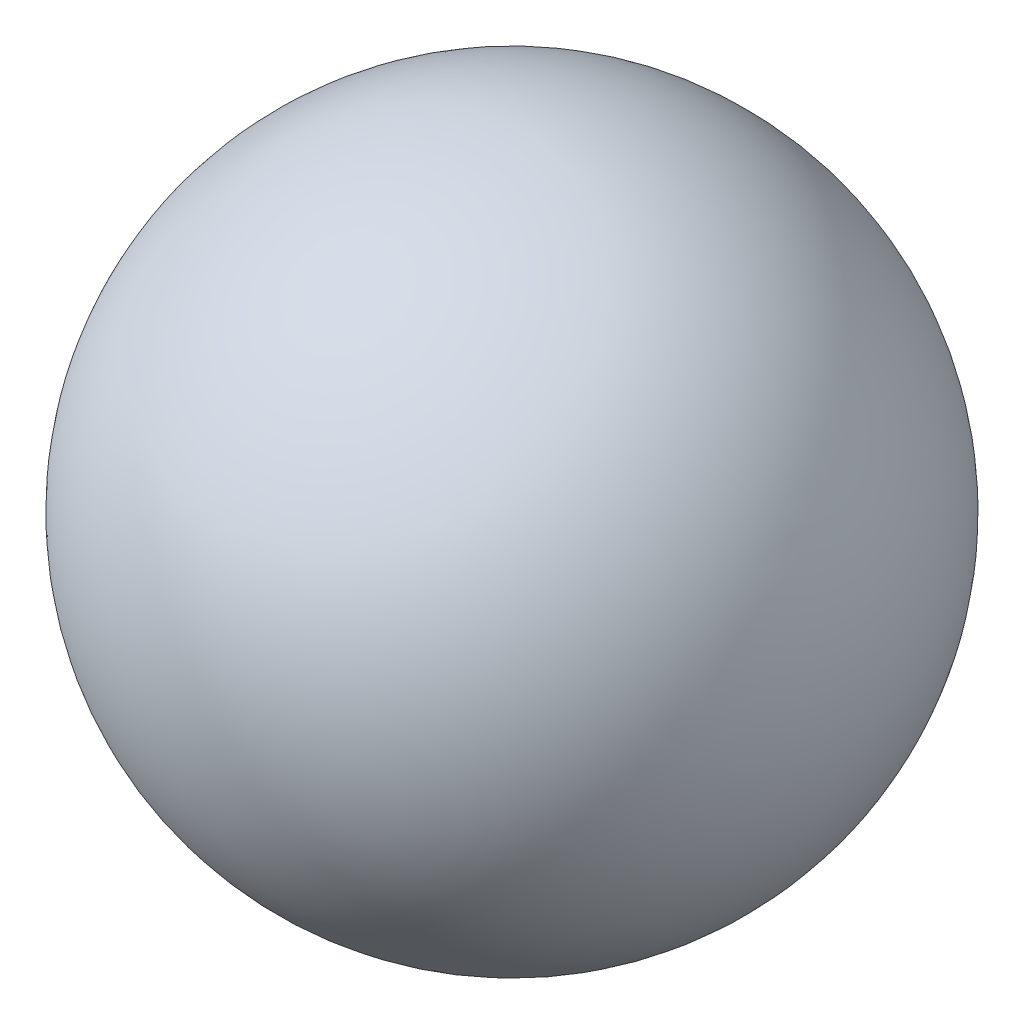
ISO-10303-21;
HEADER;
FILE_DESCRIPTION(('STEP AP214'),'2;1');
FILE_NAME('part.step','',(''),(''),'','','');
FILE_SCHEMA(('AUTOMOTIVE_DESIGN { 1 0 10303 214 1 1 1 1 }'));
ENDSEC;
DATA;
#1=APPLICATION_CONTEXT('core data for automotive mechanical design processes');
#2=APPLICATION_PROTOCOL_DEFINITION('international standard','automotive_design',2000,#1);
#3=PRODUCT_CONTEXT('',#1,'mechanical');
#4=PRODUCT('Part','Part','',(#3));
#5=PRODUCT_RELATED_PRODUCT_CATEGORY('part','',(#4));
#6=PRODUCT_DEFINITION_FORMATION('','',#4);
#7=PRODUCT_DEFINITION_CONTEXT('part definition',#1,'design');
#8=PRODUCT_DEFINITION('design','',#6,#7);
#9=PRODUCT_DEFINITION_SHAPE('','',#8);
#10=(LENGTH_UNIT() NAMED_UNIT(*) SI_UNIT(.MILLI.,.METRE.));
#11=(NAMED_UNIT(*) PLANE_ANGLE_UNIT() SI_UNIT($,.RADIAN.));
#12=(NAMED_UNIT(*) SI_UNIT($,.STERADIAN.) SOLID_ANGLE_UNIT());
#13=UNCERTAINTY_MEASURE_WITH_UNIT(LENGTH_MEASURE(1.E-05),#10,'distance_accuracy_value','');
#14=(GEOMETRIC_REPRESENTATION_CONTEXT(3) GLOBAL_UNCERTAINTY_ASSIGNED_CONTEXT((#13)) GLOBAL_UNIT_ASSIGNED_CONTEXT((#10,
#11,#12)) REPRESENTATION_CONTEXT('',''));
#15=CARTESIAN_POINT('',(0.,0.,0.));
#16=DIRECTION('',(0.,0.,1.));
#17=DIRECTION('',(1.,0.,0.));
#18=AXIS2_PLACEMENT_3D('',#15,#16,#17);
#19=CARTESIAN_POINT('',(9.,66.25,0.));
#20=DIRECTION('',(-1.,0.,0.));
#21=DIRECTION('',(0.,1.,0.));
#22=AXIS2_PLACEMENT_3D('',#19,#20,#21);
#23=SPHERICAL_SURFACE('',#22,6.747);
#24=CARTESIAN_POINT('',(2.253,66.25,0.));
#25=VERTEX_POINT('',#24);
#26=VERTEX_LOOP('',#25);
#27=FACE_BOUND('',#26,.T.);
#28=ADVANCED_FACE('F29',(#27),#23,.T.);
#29=CLOSED_SHELL('',(#28));
#30=MANIFOLD_SOLID_BREP('B2',#29);
#31=ADVANCED_BREP_SHAPE_REPRESENTATION('',(#18,#30),#14);
#32=SHAPE_DEFINITION_REPRESENTATION(#9,#31);
ENDSEC;
END-ISO-10303-21;
